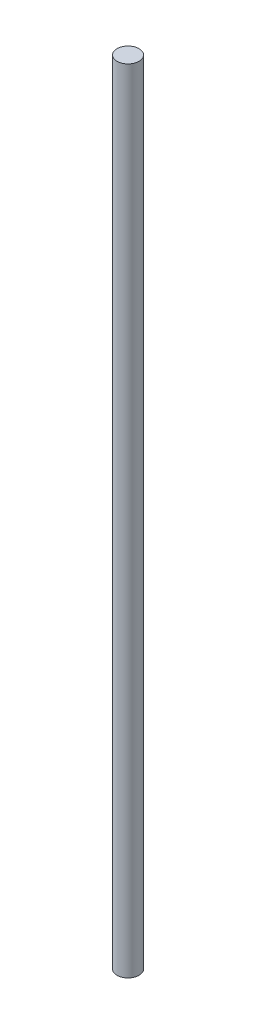
ISO-10303-21;
HEADER;
FILE_DESCRIPTION(('STEP AP214'),'2;1');
FILE_NAME('part.step','',(''),(''),'','','');
FILE_SCHEMA(('AUTOMOTIVE_DESIGN { 1 0 10303 214 1 1 1 1 }'));
ENDSEC;
DATA;
#1=APPLICATION_CONTEXT('core data for automotive mechanical design processes');
#2=APPLICATION_PROTOCOL_DEFINITION('international standard','automotive_design',2000,#1);
#3=PRODUCT_CONTEXT('',#1,'mechanical');
#4=PRODUCT('Part','Part','',(#3));
#5=PRODUCT_RELATED_PRODUCT_CATEGORY('part','',(#4));
#6=PRODUCT_DEFINITION_FORMATION('','',#4);
#7=PRODUCT_DEFINITION_CONTEXT('part definition',#1,'design');
#8=PRODUCT_DEFINITION('design','',#6,#7);
#9=PRODUCT_DEFINITION_SHAPE('','',#8);
#10=(LENGTH_UNIT() NAMED_UNIT(*) SI_UNIT(.MILLI.,.METRE.));
#11=(NAMED_UNIT(*) PLANE_ANGLE_UNIT() SI_UNIT($,.RADIAN.));
#12=(NAMED_UNIT(*) SI_UNIT($,.STERADIAN.) SOLID_ANGLE_UNIT());
#13=UNCERTAINTY_MEASURE_WITH_UNIT(LENGTH_MEASURE(1.E-05),#10,'distance_accuracy_value','');
#14=(GEOMETRIC_REPRESENTATION_CONTEXT(3) GLOBAL_UNCERTAINTY_ASSIGNED_CONTEXT((#13)) GLOBAL_UNIT_ASSIGNED_CONTEXT((#10,
#11,#12)) REPRESENTATION_CONTEXT('',''));
#15=CARTESIAN_POINT('',(0.,0.,0.));
#16=DIRECTION('',(0.,0.,1.));
#17=DIRECTION('',(1.,0.,0.));
#18=AXIS2_PLACEMENT_3D('',#15,#16,#17);
#19=CARTESIAN_POINT('',(0.,360.,0.));
#20=DIRECTION('',(0.,-1.,0.));
#21=DIRECTION('',(0.,0.,-1.));
#22=AXIS2_PLACEMENT_3D('',#19,#20,#21);
#23=CYLINDRICAL_SURFACE('',#22,5.);
#24=CARTESIAN_POINT('',(0.,360.,0.));
#25=DIRECTION('',(0.,1.,0.));
#26=DIRECTION('',(0.,0.,1.));
#27=AXIS2_PLACEMENT_3D('',#24,#25,#26);
#28=CIRCLE('',#27,5.);
#29=CARTESIAN_POINT('',(0.,360.,-5.));
#30=VERTEX_POINT('',#29);
#31=EDGE_CURVE('E10',#30,#30,#28,.T.);
#32=CARTESIAN_POINT('',(0.,0.,0.));
#33=DIRECTION('',(0.,1.,0.));
#34=DIRECTION('',(0.,0.,1.));
#35=AXIS2_PLACEMENT_3D('',#32,#33,#34);
#36=CIRCLE('',#35,5.);
#37=CARTESIAN_POINT('',(0.,0.,-5.));
#38=VERTEX_POINT('',#37);
#39=EDGE_CURVE('E34',#38,#38,#36,.T.);
#40=CARTESIAN_POINT('',(0.,360.,-5.));
#41=CARTESIAN_POINT('',(0.,356.25,-5.));
#42=CARTESIAN_POINT('',(0.,352.5,-5.));
#43=CARTESIAN_POINT('',(0.,345.,-5.));
#44=CARTESIAN_POINT('',(0.,341.25,-5.));
#45=CARTESIAN_POINT('',(0.,333.75,-5.));
#46=CARTESIAN_POINT('',(0.,330.,-5.));
#47=CARTESIAN_POINT('',(0.,322.5,-5.));
#48=CARTESIAN_POINT('',(0.,318.75,-5.));
#49=CARTESIAN_POINT('',(0.,311.25,-5.));
#50=CARTESIAN_POINT('',(0.,307.5,-5.));
#51=CARTESIAN_POINT('',(0.,300.,-5.));
#52=CARTESIAN_POINT('',(0.,296.25,-5.));
#53=CARTESIAN_POINT('',(0.,288.75,-5.));
#54=CARTESIAN_POINT('',(0.,285.,-5.));
#55=CARTESIAN_POINT('',(0.,277.5,-5.));
#56=CARTESIAN_POINT('',(0.,273.75,-5.));
#57=CARTESIAN_POINT('',(0.,266.25,-5.));
#58=CARTESIAN_POINT('',(0.,262.5,-5.));
#59=CARTESIAN_POINT('',(0.,255.,-5.));
#60=CARTESIAN_POINT('',(0.,251.25,-5.));
#61=CARTESIAN_POINT('',(0.,243.75,-5.));
#62=CARTESIAN_POINT('',(0.,240.,-5.));
#63=CARTESIAN_POINT('',(0.,232.5,-5.));
#64=CARTESIAN_POINT('',(0.,228.75,-5.));
#65=CARTESIAN_POINT('',(0.,221.25,-5.));
#66=CARTESIAN_POINT('',(0.,217.5,-5.));
#67=CARTESIAN_POINT('',(0.,210.,-5.));
#68=CARTESIAN_POINT('',(0.,206.25,-5.));
#69=CARTESIAN_POINT('',(0.,198.75,-5.));
#70=CARTESIAN_POINT('',(0.,195.,-5.));
#71=CARTESIAN_POINT('',(0.,187.5,-5.));
#72=CARTESIAN_POINT('',(0.,183.75,-5.));
#73=CARTESIAN_POINT('',(0.,176.25,-5.));
#74=CARTESIAN_POINT('',(0.,172.5,-5.));
#75=CARTESIAN_POINT('',(0.,165.,-5.));
#76=CARTESIAN_POINT('',(0.,161.25,-5.));
#77=CARTESIAN_POINT('',(0.,153.75,-5.));
#78=CARTESIAN_POINT('',(0.,150.,-5.));
#79=CARTESIAN_POINT('',(0.,142.5,-5.));
#80=CARTESIAN_POINT('',(0.,138.75,-5.));
#81=CARTESIAN_POINT('',(0.,131.25,-5.));
#82=CARTESIAN_POINT('',(0.,127.5,-5.));
#83=CARTESIAN_POINT('',(0.,120.,-5.));
#84=CARTESIAN_POINT('',(0.,116.25,-5.));
#85=CARTESIAN_POINT('',(0.,108.75,-5.));
#86=CARTESIAN_POINT('',(0.,105.,-5.));
#87=CARTESIAN_POINT('',(0.,97.5,-5.));
#88=CARTESIAN_POINT('',(0.,93.75,-5.));
#89=CARTESIAN_POINT('',(0.,86.25,-5.));
#90=CARTESIAN_POINT('',(0.,82.4999999999999,-5.));
#91=CARTESIAN_POINT('',(0.,74.9999999999999,-5.));
#92=CARTESIAN_POINT('',(0.,71.2499999999999,-5.));
#93=CARTESIAN_POINT('',(0.,63.75,-5.));
#94=CARTESIAN_POINT('',(0.,60.,-5.));
#95=CARTESIAN_POINT('',(0.,52.5,-5.));
#96=CARTESIAN_POINT('',(0.,48.7499999999999,-5.));
#97=CARTESIAN_POINT('',(0.,41.2499999999999,-5.));
#98=CARTESIAN_POINT('',(0.,37.4999999999999,-5.));
#99=CARTESIAN_POINT('',(0.,30.,-5.));
#100=CARTESIAN_POINT('',(0.,26.25,-5.));
#101=CARTESIAN_POINT('',(0.,18.75,-5.));
#102=CARTESIAN_POINT('',(0.,14.9999999999999,-5.));
#103=CARTESIAN_POINT('',(0.,7.49999999999993,-5.));
#104=CARTESIAN_POINT('',(0.,3.74999999999994,-5.));
#105=CARTESIAN_POINT('',(0.,0.,-5.));
#106=B_SPLINE_CURVE_WITH_KNOTS('',3,(#40,#41,#42,#43,#44,#45,#46,#47,#48,#49,#50,#51,#52,#53,
#54,#55,#56,#57,#58,#59,#60,#61,#62,#63,#64,#65,#66,#67,#68,#69,#70,#71,#72,#73,#74,#75,#76,#77,
#78,#79,#80,#81,#82,#83,#84,#85,#86,#87,#88,#89,#90,#91,#92,#93,#94,#95,#96,#97,#98,#99,#100,
#101,#102,#103,#104,#105),.UNSPECIFIED.,.F.,.F.,(4,2,2,2,2,2,2,2,2,2,2,2,2,2,2,2,2,2,2,2,2,2,2,
2,2,2,2,2,2,2,2,2,4),(0.,11.25,22.5,33.7499999999999,45.,56.25,67.4999999999999,78.75,90.,
101.25,112.5,123.75,135.,146.25,157.5,168.75,180.,191.25,202.5,213.75,225.,236.25,247.5,258.75,
270.,281.25,292.5,303.75,315.,326.25,337.5,348.75,360.),.UNSPECIFIED.);
#107=EDGE_CURVE('BSEAM31',#30,#38,#106,.T.);
#108=ORIENTED_EDGE('',*,*,#31,.F.);
#109=ORIENTED_EDGE('',*,*,#39,.T.);
#110=ORIENTED_EDGE('',*,*,#107,.T.);
#111=ORIENTED_EDGE('',*,*,#107,.F.);
#112=EDGE_LOOP('',(#108,#110,#109,#111));
#113=FACE_BOUND('',#112,.T.);
#114=ADVANCED_FACE('F31',(#113),#23,.T.);
#115=CARTESIAN_POINT('',(0.,360.,0.));
#116=DIRECTION('',(0.,1.,0.));
#117=DIRECTION('',(0.,0.,1.));
#118=AXIS2_PLACEMENT_3D('',#115,#116,#117);
#119=PLANE('',#118);
#120=ORIENTED_EDGE('',*,*,#31,.T.);
#121=EDGE_LOOP('',(#120));
#122=FACE_BOUND('',#121,.T.);
#123=ADVANCED_FACE('F46',(#122),#119,.T.);
#124=CARTESIAN_POINT('',(0.,0.,0.));
#125=DIRECTION('',(0.,1.,0.));
#126=DIRECTION('',(0.,0.,1.));
#127=AXIS2_PLACEMENT_3D('',#124,#125,#126);
#128=PLANE('',#127);
#129=ORIENTED_EDGE('',*,*,#39,.F.);
#130=EDGE_LOOP('',(#129));
#131=FACE_BOUND('',#130,.T.);
#132=ADVANCED_FACE('F44',(#131),#128,.F.);
#133=CLOSED_SHELL('',(#114,#123,#132));
#134=MANIFOLD_SOLID_BREP('B2',#133);
#135=ADVANCED_BREP_SHAPE_REPRESENTATION('',(#18,#134),#14);
#136=SHAPE_DEFINITION_REPRESENTATION(#9,#135);
ENDSEC;
END-ISO-10303-21;
